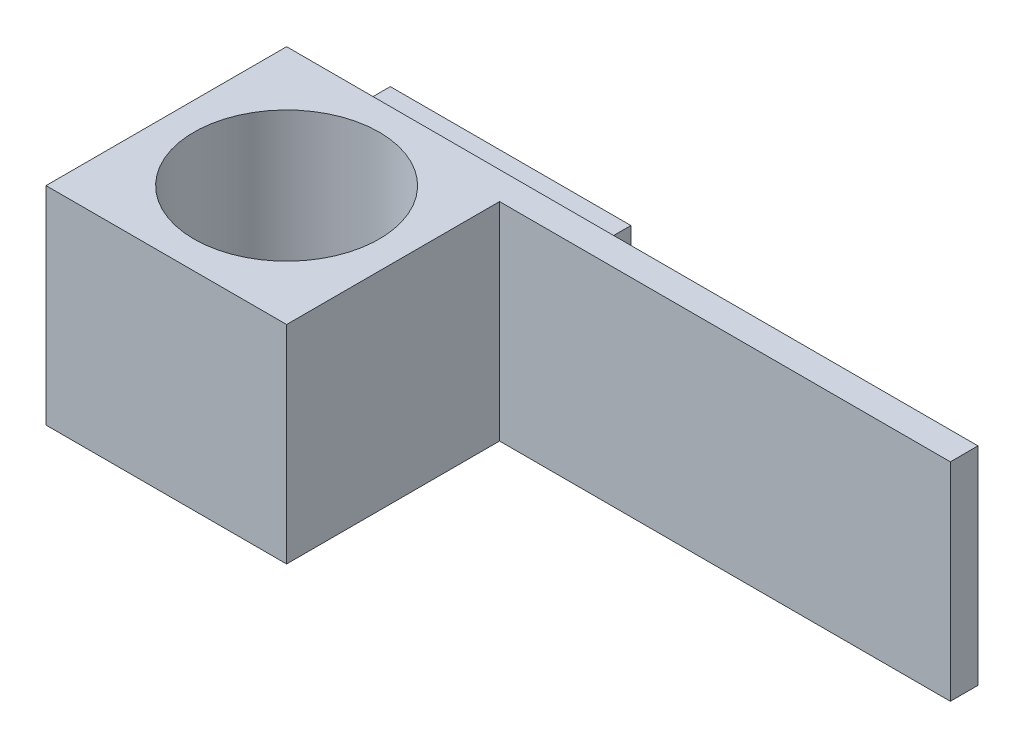
ISO-10303-21;
HEADER;
FILE_DESCRIPTION(('STEP AP214'),'2;1');
FILE_NAME('part.step','',(''),(''),'','','');
FILE_SCHEMA(('AUTOMOTIVE_DESIGN { 1 0 10303 214 1 1 1 1 }'));
ENDSEC;
DATA;
#1=APPLICATION_CONTEXT('core data for automotive mechanical design processes');
#2=APPLICATION_PROTOCOL_DEFINITION('international standard','automotive_design',2000,#1);
#3=PRODUCT_CONTEXT('',#1,'mechanical');
#4=PRODUCT('Part','Part','',(#3));
#5=PRODUCT_RELATED_PRODUCT_CATEGORY('part','',(#4));
#6=PRODUCT_DEFINITION_FORMATION('','',#4);
#7=PRODUCT_DEFINITION_CONTEXT('part definition',#1,'design');
#8=PRODUCT_DEFINITION('design','',#6,#7);
#9=PRODUCT_DEFINITION_SHAPE('','',#8);
#10=(LENGTH_UNIT() NAMED_UNIT(*) SI_UNIT(.MILLI.,.METRE.));
#11=(NAMED_UNIT(*) PLANE_ANGLE_UNIT() SI_UNIT($,.RADIAN.));
#12=(NAMED_UNIT(*) SI_UNIT($,.STERADIAN.) SOLID_ANGLE_UNIT());
#13=UNCERTAINTY_MEASURE_WITH_UNIT(LENGTH_MEASURE(1.E-05),#10,'distance_accuracy_value','');
#14=(GEOMETRIC_REPRESENTATION_CONTEXT(3) GLOBAL_UNCERTAINTY_ASSIGNED_CONTEXT((#13)) GLOBAL_UNIT_ASSIGNED_CONTEXT((#10,
#11,#12)) REPRESENTATION_CONTEXT('',''));
#15=CARTESIAN_POINT('',(0.,0.,0.));
#16=DIRECTION('',(0.,0.,1.));
#17=DIRECTION('',(1.,0.,0.));
#18=AXIS2_PLACEMENT_3D('',#15,#16,#17);
#19=CARTESIAN_POINT('',(0.,30.,-17.4));
#20=DIRECTION('',(0.,0.,-1.));
#21=DIRECTION('',(-1.,0.,0.));
#22=AXIS2_PLACEMENT_3D('',#19,#20,#21);
#23=PLANE('',#22);
#24=DIRECTION('',(-1.,0.,0.));
#25=VECTOR('',#24,1.);
#26=CARTESIAN_POINT('',(17.4,17.5,-17.4));
#27=LINE('',#26,#25);
#28=CARTESIAN_POINT('',(17.4,17.5,-17.4));
#29=VERTEX_POINT('',#28);
#30=CARTESIAN_POINT('',(-17.4,17.5,-17.4));
#31=VERTEX_POINT('',#30);
#32=EDGE_CURVE('E185',#29,#31,#27,.T.);
#33=ORIENTED_EDGE('',*,*,#32,.T.);
#34=DIRECTION('',(0.,-1.,0.));
#35=VECTOR('',#34,1.);
#36=CARTESIAN_POINT('',(-17.4,30.,-17.4));
#37=LINE('',#36,#35);
#38=CARTESIAN_POINT('',(-17.4,30.,-17.4));
#39=VERTEX_POINT('',#38);
#40=EDGE_CURVE('E43',#39,#31,#37,.T.);
#41=ORIENTED_EDGE('',*,*,#40,.F.);
#42=DIRECTION('',(1.,0.,0.));
#43=VECTOR('',#42,1.);
#44=CARTESIAN_POINT('',(0.,30.,-17.4));
#45=LINE('',#44,#43);
#46=CARTESIAN_POINT('',(82.6,30.,-17.4));
#47=VERTEX_POINT('',#46);
#48=EDGE_CURVE('E229',#39,#47,#45,.T.);
#49=ORIENTED_EDGE('',*,*,#48,.T.);
#50=DIRECTION('',(0.,-1.,0.));
#51=VECTOR('',#50,1.);
#52=CARTESIAN_POINT('',(82.6,30.,-17.4));
#53=LINE('',#52,#51);
#54=CARTESIAN_POINT('',(82.6,0.,-17.4));
#55=VERTEX_POINT('',#54);
#56=EDGE_CURVE('E11',#47,#55,#53,.T.);
#57=ORIENTED_EDGE('',*,*,#56,.T.);
#58=DIRECTION('',(1.,0.,0.));
#59=VECTOR('',#58,1.);
#60=CARTESIAN_POINT('',(0.,0.,-17.4));
#61=LINE('',#60,#59);
#62=CARTESIAN_POINT('',(17.4,0.,-17.4));
#63=VERTEX_POINT('',#62);
#64=EDGE_CURVE('E248',#63,#55,#61,.T.);
#65=ORIENTED_EDGE('',*,*,#64,.F.);
#66=DIRECTION('',(0.,1.,0.));
#67=VECTOR('',#66,1.);
#68=CARTESIAN_POINT('',(17.4,7.55713562565662,-17.4));
#69=LINE('',#68,#67);
#70=CARTESIAN_POINT('',(17.4,7.55713562565662,-17.4));
#71=VERTEX_POINT('',#70);
#72=EDGE_CURVE('E189',#63,#71,#69,.T.);
#73=ORIENTED_EDGE('',*,*,#72,.T.);
#74=DIRECTION('',(-1.,0.,0.));
#75=VECTOR('',#74,1.);
#76=CARTESIAN_POINT('',(17.4,7.55713562565662,-17.4));
#77=LINE('',#76,#75);
#78=CARTESIAN_POINT('',(-17.4,7.55713562565662,-17.4));
#79=VERTEX_POINT('',#78);
#80=EDGE_CURVE('E205',#71,#79,#77,.T.);
#81=ORIENTED_EDGE('',*,*,#80,.T.);
#82=CARTESIAN_POINT('',(-17.4,10.5571356256566,-17.4));
#83=VERTEX_POINT('',#82);
#84=EDGE_CURVE('E55',#83,#79,#37,.T.);
#85=ORIENTED_EDGE('',*,*,#84,.F.);
#86=DIRECTION('',(-1.,0.,0.));
#87=VECTOR('',#86,1.);
#88=CARTESIAN_POINT('',(17.4,10.5571356256566,-17.4));
#89=LINE('',#88,#87);
#90=CARTESIAN_POINT('',(17.4,10.5571356256566,-17.4));
#91=VERTEX_POINT('',#90);
#92=EDGE_CURVE('E150',#91,#83,#89,.T.);
#93=ORIENTED_EDGE('',*,*,#92,.F.);
#94=DIRECTION('',(0.,1.,0.));
#95=VECTOR('',#94,1.);
#96=CARTESIAN_POINT('',(17.4,17.5,-17.4));
#97=LINE('',#96,#95);
#98=EDGE_CURVE('E161',#91,#29,#97,.T.);
#99=ORIENTED_EDGE('',*,*,#98,.T.);
#100=EDGE_LOOP('',(#33,#41,#49,#57,#65,#73,#81,#85,#93,#99));
#101=FACE_BOUND('',#100,.T.);
#102=ADVANCED_FACE('F35',(#101),#23,.T.);
#103=CARTESIAN_POINT('',(82.6,30.,0.));
#104=DIRECTION('',(1.,0.,0.));
#105=DIRECTION('',(0.,0.,-1.));
#106=AXIS2_PLACEMENT_3D('',#103,#104,#105);
#107=PLANE('',#106);
#108=DIRECTION('',(0.,0.,1.));
#109=VECTOR('',#108,1.);
#110=CARTESIAN_POINT('',(82.6,0.,0.));
#111=LINE('',#110,#109);
#112=CARTESIAN_POINT('',(82.6,0.,-13.4));
#113=VERTEX_POINT('',#112);
#114=EDGE_CURVE('E245',#55,#113,#111,.T.);
#115=ORIENTED_EDGE('',*,*,#114,.F.);
#116=ORIENTED_EDGE('',*,*,#56,.F.);
#117=DIRECTION('',(0.,0.,1.));
#118=VECTOR('',#117,1.);
#119=CARTESIAN_POINT('',(82.6,30.,0.));
#120=LINE('',#119,#118);
#121=CARTESIAN_POINT('',(82.6,30.,-13.4));
#122=VERTEX_POINT('',#121);
#123=EDGE_CURVE('E225',#47,#122,#120,.T.);
#124=ORIENTED_EDGE('',*,*,#123,.T.);
#125=DIRECTION('',(0.,-1.,0.));
#126=VECTOR('',#125,1.);
#127=CARTESIAN_POINT('',(82.6,30.,-13.4));
#128=LINE('',#127,#126);
#129=EDGE_CURVE('E242',#122,#113,#128,.T.);
#130=ORIENTED_EDGE('',*,*,#129,.T.);
#131=EDGE_LOOP('',(#115,#116,#124,#130));
#132=FACE_BOUND('',#131,.T.);
#133=ADVANCED_FACE('F290',(#132),#107,.T.);
#134=CARTESIAN_POINT('',(-17.4,30.,0.));
#135=DIRECTION('',(1.,0.,0.));
#136=DIRECTION('',(0.,0.,-1.));
#137=AXIS2_PLACEMENT_3D('',#134,#135,#136);
#138=PLANE('',#137);
#139=DIRECTION('',(0.,0.,1.));
#140=VECTOR('',#139,1.);
#141=CARTESIAN_POINT('',(-17.4,0.,0.));
#142=LINE('',#141,#140);
#143=CARTESIAN_POINT('',(-17.4,0.,-32.4));
#144=VERTEX_POINT('',#143);
#145=CARTESIAN_POINT('',(-17.4,0.,17.4));
#146=VERTEX_POINT('',#145);
#147=EDGE_CURVE('E250',#144,#146,#142,.T.);
#148=ORIENTED_EDGE('',*,*,#147,.T.);
#149=DIRECTION('',(0.,-1.,0.));
#150=VECTOR('',#149,1.);
#151=CARTESIAN_POINT('',(-17.4,30.,17.4));
#152=LINE('',#151,#150);
#153=CARTESIAN_POINT('',(-17.4,30.,17.4));
#154=VERTEX_POINT('',#153);
#155=EDGE_CURVE('E266',#154,#146,#152,.T.);
#156=ORIENTED_EDGE('',*,*,#155,.F.);
#157=DIRECTION('',(0.,0.,1.));
#158=VECTOR('',#157,1.);
#159=CARTESIAN_POINT('',(-17.4,30.,0.));
#160=LINE('',#159,#158);
#161=EDGE_CURVE('E232',#39,#154,#160,.T.);
#162=ORIENTED_EDGE('',*,*,#161,.F.);
#163=ORIENTED_EDGE('',*,*,#40,.T.);
#164=DIRECTION('',(0.,0.,-1.));
#165=VECTOR('',#164,1.);
#166=CARTESIAN_POINT('',(-17.4,17.5,-32.4));
#167=LINE('',#166,#165);
#168=CARTESIAN_POINT('',(-17.4,17.5,-32.4));
#169=VERTEX_POINT('',#168);
#170=EDGE_CURVE('E168',#31,#169,#167,.T.);
#171=ORIENTED_EDGE('',*,*,#170,.T.);
#172=DIRECTION('',(0.,-1.,0.));
#173=VECTOR('',#172,1.);
#174=CARTESIAN_POINT('',(-17.4,14.5,-32.4));
#175=LINE('',#174,#173);
#176=CARTESIAN_POINT('',(-17.4,14.5,-32.4));
#177=VERTEX_POINT('',#176);
#178=EDGE_CURVE('E165',#169,#177,#175,.T.);
#179=ORIENTED_EDGE('',*,*,#178,.T.);
#180=CARTESIAN_POINT('',(-17.4,8.75,-30.6860863498997));
#181=DIRECTION('',(1.,0.,0.));
#182=DIRECTION('',(0.,0.,1.));
#183=AXIS2_PLACEMENT_3D('',#180,#181,#182);
#184=CIRCLE('',#183,6.);
#185=CARTESIAN_POINT('',(-17.4,10.5571356256566,-24.9647000816529));
#186=VERTEX_POINT('',#185);
#187=EDGE_CURVE('E176',#177,#186,#184,.T.);
#188=ORIENTED_EDGE('',*,*,#187,.T.);
#189=DIRECTION('',(0.,0.,1.));
#190=VECTOR('',#189,1.);
#191=CARTESIAN_POINT('',(-17.4,10.5571356256566,-24.9647000816529));
#192=LINE('',#191,#190);
#193=EDGE_CURVE('E50',#186,#83,#192,.T.);
#194=ORIENTED_EDGE('',*,*,#193,.T.);
#195=ORIENTED_EDGE('',*,*,#84,.T.);
#196=DIRECTION('',(0.,0.,-1.));
#197=VECTOR('',#196,1.);
#198=CARTESIAN_POINT('',(-17.4,7.55713562565662,-24.8058589236497));
#199=LINE('',#198,#197);
#200=CARTESIAN_POINT('',(-17.4,7.55713562565662,-24.8058589236497));
#201=VERTEX_POINT('',#200);
#202=EDGE_CURVE('E182',#79,#201,#199,.T.);
#203=ORIENTED_EDGE('',*,*,#202,.T.);
#204=CARTESIAN_POINT('',(-17.4,8.75,-30.6860863498997));
#205=DIRECTION('',(1.,0.,0.));
#206=DIRECTION('',(0.,0.,1.));
#207=AXIS2_PLACEMENT_3D('',#204,#205,#206);
#208=CIRCLE('',#207,6.);
#209=CARTESIAN_POINT('',(-17.4,3.,-32.4));
#210=VERTEX_POINT('',#209);
#211=EDGE_CURVE('E207',#201,#210,#208,.T.);
#212=ORIENTED_EDGE('',*,*,#211,.T.);
#213=DIRECTION('',(0.,-1.,0.));
#214=VECTOR('',#213,1.);
#215=CARTESIAN_POINT('',(-17.4,0.,-32.4));
#216=LINE('',#215,#214);
#217=EDGE_CURVE('E193',#210,#144,#216,.T.);
#218=ORIENTED_EDGE('',*,*,#217,.T.);
#219=EDGE_LOOP('',(#148,#156,#162,#163,#171,#179,#188,#194,#195,#203,#212,#218));
#220=FACE_BOUND('',#219,.T.);
#221=ADVANCED_FACE('F270',(#220),#138,.F.);
#222=CARTESIAN_POINT('',(0.,30.,17.4));
#223=DIRECTION('',(0.,0.,-1.));
#224=DIRECTION('',(-1.,0.,0.));
#225=AXIS2_PLACEMENT_3D('',#222,#223,#224);
#226=PLANE('',#225);
#227=DIRECTION('',(1.,0.,0.));
#228=VECTOR('',#227,1.);
#229=CARTESIAN_POINT('',(0.,0.,17.4));
#230=LINE('',#229,#228);
#231=CARTESIAN_POINT('',(17.4,0.,17.4));
#232=VERTEX_POINT('',#231);
#233=EDGE_CURVE('E253',#146,#232,#230,.T.);
#234=ORIENTED_EDGE('',*,*,#233,.T.);
#235=DIRECTION('',(0.,-1.,0.));
#236=VECTOR('',#235,1.);
#237=CARTESIAN_POINT('',(17.4,30.,17.4));
#238=LINE('',#237,#236);
#239=CARTESIAN_POINT('',(17.4,30.,17.4));
#240=VERTEX_POINT('',#239);
#241=EDGE_CURVE('E264',#240,#232,#238,.T.);
#242=ORIENTED_EDGE('',*,*,#241,.F.);
#243=DIRECTION('',(1.,0.,0.));
#244=VECTOR('',#243,1.);
#245=CARTESIAN_POINT('',(0.,30.,17.4));
#246=LINE('',#245,#244);
#247=EDGE_CURVE('E235',#154,#240,#246,.T.);
#248=ORIENTED_EDGE('',*,*,#247,.F.);
#249=ORIENTED_EDGE('',*,*,#155,.T.);
#250=EDGE_LOOP('',(#234,#242,#248,#249));
#251=FACE_BOUND('',#250,.T.);
#252=ADVANCED_FACE('F299',(#251),#226,.F.);
#253=CARTESIAN_POINT('',(17.4,30.,0.));
#254=DIRECTION('',(1.,0.,0.));
#255=DIRECTION('',(0.,0.,-1.));
#256=AXIS2_PLACEMENT_3D('',#253,#254,#255);
#257=PLANE('',#256);
#258=DIRECTION('',(0.,0.,1.));
#259=VECTOR('',#258,1.);
#260=CARTESIAN_POINT('',(17.4,0.,0.));
#261=LINE('',#260,#259);
#262=CARTESIAN_POINT('',(17.4,0.,-13.4));
#263=VERTEX_POINT('',#262);
#264=EDGE_CURVE('E256',#263,#232,#261,.T.);
#265=ORIENTED_EDGE('',*,*,#264,.F.);
#266=DIRECTION('',(0.,-1.,0.));
#267=VECTOR('',#266,1.);
#268=CARTESIAN_POINT('',(17.4,30.,-13.4));
#269=LINE('',#268,#267);
#270=CARTESIAN_POINT('',(17.4,30.,-13.4));
#271=VERTEX_POINT('',#270);
#272=EDGE_CURVE('E262',#271,#263,#269,.T.);
#273=ORIENTED_EDGE('',*,*,#272,.F.);
#274=DIRECTION('',(0.,0.,1.));
#275=VECTOR('',#274,1.);
#276=CARTESIAN_POINT('',(17.4,30.,0.));
#277=LINE('',#276,#275);
#278=EDGE_CURVE('E237',#271,#240,#277,.T.);
#279=ORIENTED_EDGE('',*,*,#278,.T.);
#280=ORIENTED_EDGE('',*,*,#241,.T.);
#281=EDGE_LOOP('',(#265,#273,#279,#280));
#282=FACE_BOUND('',#281,.T.);
#283=ADVANCED_FACE('F302',(#282),#257,.T.);
#284=CARTESIAN_POINT('',(0.,30.,0.));
#285=DIRECTION('',(0.,-1.,0.));
#286=DIRECTION('',(0.,0.,-1.));
#287=AXIS2_PLACEMENT_3D('',#284,#285,#286);
#288=CYLINDRICAL_SURFACE('',#287,13.4);
#289=CARTESIAN_POINT('',(0.,30.,0.));
#290=DIRECTION('',(0.,1.,0.));
#291=DIRECTION('',(0.,0.,1.));
#292=AXIS2_PLACEMENT_3D('',#289,#290,#291);
#293=CIRCLE('',#292,13.4);
#294=CARTESIAN_POINT('',(0.,30.,13.4));
#295=VERTEX_POINT('',#294);
#296=EDGE_CURVE('E222',#295,#295,#293,.T.);
#297=ORIENTED_EDGE('',*,*,#296,.T.);
#298=EDGE_LOOP('',(#297));
#299=FACE_BOUND('',#298,.T.);
#300=CARTESIAN_POINT('',(0.,0.,0.));
#301=DIRECTION('',(0.,1.,0.));
#302=DIRECTION('',(0.,0.,1.));
#303=AXIS2_PLACEMENT_3D('',#300,#301,#302);
#304=CIRCLE('',#303,13.4);
#305=CARTESIAN_POINT('',(0.,0.,13.4));
#306=VERTEX_POINT('',#305);
#307=EDGE_CURVE('E215',#306,#306,#304,.T.);
#308=ORIENTED_EDGE('',*,*,#307,.F.);
#309=EDGE_LOOP('',(#308));
#310=FACE_BOUND('',#309,.T.);
#311=ADVANCED_FACE('F37',(#299,#310),#288,.F.);
#312=CARTESIAN_POINT('',(0.,30.,-13.4));
#313=DIRECTION('',(0.,0.,-1.));
#314=DIRECTION('',(-1.,0.,0.));
#315=AXIS2_PLACEMENT_3D('',#312,#313,#314);
#316=PLANE('',#315);
#317=DIRECTION('',(1.,0.,0.));
#318=VECTOR('',#317,1.);
#319=CARTESIAN_POINT('',(0.,0.,-13.4));
#320=LINE('',#319,#318);
#321=EDGE_CURVE('E226',#263,#113,#320,.T.);
#322=ORIENTED_EDGE('',*,*,#321,.T.);
#323=ORIENTED_EDGE('',*,*,#129,.F.);
#324=DIRECTION('',(1.,0.,0.));
#325=VECTOR('',#324,1.);
#326=CARTESIAN_POINT('',(0.,30.,-13.4));
#327=LINE('',#326,#325);
#328=EDGE_CURVE('E240',#271,#122,#327,.T.);
#329=ORIENTED_EDGE('',*,*,#328,.F.);
#330=ORIENTED_EDGE('',*,*,#272,.T.);
#331=EDGE_LOOP('',(#322,#323,#329,#330));
#332=FACE_BOUND('',#331,.T.);
#333=ADVANCED_FACE('F307',(#332),#316,.F.);
#334=CARTESIAN_POINT('',(0.,30.,0.));
#335=DIRECTION('',(0.,1.,0.));
#336=DIRECTION('',(0.,0.,1.));
#337=AXIS2_PLACEMENT_3D('',#334,#335,#336);
#338=PLANE('',#337);
#339=ORIENTED_EDGE('',*,*,#296,.F.);
#340=EDGE_LOOP('',(#339));
#341=FACE_BOUND('',#340,.T.);
#342=ORIENTED_EDGE('',*,*,#123,.F.);
#343=ORIENTED_EDGE('',*,*,#48,.F.);
#344=ORIENTED_EDGE('',*,*,#161,.T.);
#345=ORIENTED_EDGE('',*,*,#247,.T.);
#346=ORIENTED_EDGE('',*,*,#278,.F.);
#347=ORIENTED_EDGE('',*,*,#328,.T.);
#348=EDGE_LOOP('',(#342,#343,#344,#345,#346,#347));
#349=FACE_BOUND('',#348,.T.);
#350=ADVANCED_FACE('F310',(#341,#349),#338,.T.);
#351=CARTESIAN_POINT('',(0.,0.,0.));
#352=DIRECTION('',(0.,1.,0.));
#353=DIRECTION('',(0.,0.,1.));
#354=AXIS2_PLACEMENT_3D('',#351,#352,#353);
#355=PLANE('',#354);
#356=ORIENTED_EDGE('',*,*,#307,.T.);
#357=EDGE_LOOP('',(#356));
#358=FACE_BOUND('',#357,.T.);
#359=ORIENTED_EDGE('',*,*,#114,.T.);
#360=ORIENTED_EDGE('',*,*,#321,.F.);
#361=ORIENTED_EDGE('',*,*,#264,.T.);
#362=ORIENTED_EDGE('',*,*,#233,.F.);
#363=ORIENTED_EDGE('',*,*,#147,.F.);
#364=DIRECTION('',(-1.,0.,0.));
#365=VECTOR('',#364,1.);
#366=CARTESIAN_POINT('',(17.4,0.,-32.4));
#367=LINE('',#366,#365);
#368=CARTESIAN_POINT('',(17.4,0.,-32.4));
#369=VERTEX_POINT('',#368);
#370=EDGE_CURVE('E212',#369,#144,#367,.T.);
#371=ORIENTED_EDGE('',*,*,#370,.F.);
#372=DIRECTION('',(0.,0.,1.));
#373=VECTOR('',#372,1.);
#374=CARTESIAN_POINT('',(17.4,0.,-17.4));
#375=LINE('',#374,#373);
#376=EDGE_CURVE('E202',#369,#63,#375,.T.);
#377=ORIENTED_EDGE('',*,*,#376,.T.);
#378=ORIENTED_EDGE('',*,*,#64,.T.);
#379=EDGE_LOOP('',(#359,#360,#361,#362,#363,#371,#377,#378));
#380=FACE_BOUND('',#379,.T.);
#381=ADVANCED_FACE('F312',(#358,#380),#355,.F.);
#382=CARTESIAN_POINT('',(17.4,0.,-32.4));
#383=DIRECTION('',(0.,0.,-1.));
#384=DIRECTION('',(-1.,0.,0.));
#385=AXIS2_PLACEMENT_3D('',#382,#383,#384);
#386=PLANE('',#385);
#387=ORIENTED_EDGE('',*,*,#217,.F.);
#388=DIRECTION('',(-1.,0.,0.));
#389=VECTOR('',#388,1.);
#390=CARTESIAN_POINT('',(17.4,3.,-32.4));
#391=LINE('',#390,#389);
#392=CARTESIAN_POINT('',(17.4,3.,-32.4));
#393=VERTEX_POINT('',#392);
#394=EDGE_CURVE('E216',#393,#210,#391,.T.);
#395=ORIENTED_EDGE('',*,*,#394,.F.);
#396=DIRECTION('',(0.,-1.,0.));
#397=VECTOR('',#396,1.);
#398=CARTESIAN_POINT('',(17.4,0.,-32.4));
#399=LINE('',#398,#397);
#400=EDGE_CURVE('E199',#393,#369,#399,.T.);
#401=ORIENTED_EDGE('',*,*,#400,.T.);
#402=ORIENTED_EDGE('',*,*,#370,.T.);
#403=EDGE_LOOP('',(#387,#395,#401,#402));
#404=FACE_BOUND('',#403,.T.);
#405=ADVANCED_FACE('F315',(#404),#386,.T.);
#406=CARTESIAN_POINT('',(17.4,8.75,-30.6860863498997));
#407=DIRECTION('',(-1.,0.,0.));
#408=DIRECTION('',(0.,0.,1.));
#409=AXIS2_PLACEMENT_3D('',#406,#407,#408);
#410=CYLINDRICAL_SURFACE('',#409,6.);
#411=ORIENTED_EDGE('',*,*,#211,.F.);
#412=DIRECTION('',(-1.,0.,0.));
#413=VECTOR('',#412,1.);
#414=CARTESIAN_POINT('',(17.4,7.55713562565662,-24.8058589236498));
#415=LINE('',#414,#413);
#416=CARTESIAN_POINT('',(17.4,7.55713562565662,-24.8058589236498));
#417=VERTEX_POINT('',#416);
#418=EDGE_CURVE('E218',#417,#201,#415,.T.);
#419=ORIENTED_EDGE('',*,*,#418,.F.);
#420=CARTESIAN_POINT('',(17.4,8.75,-30.6860863498997));
#421=DIRECTION('',(1.,0.,0.));
#422=DIRECTION('',(0.,0.,1.));
#423=AXIS2_PLACEMENT_3D('',#420,#421,#422);
#424=CIRCLE('',#423,6.);
#425=EDGE_CURVE('E196',#417,#393,#424,.T.);
#426=ORIENTED_EDGE('',*,*,#425,.T.);
#427=ORIENTED_EDGE('',*,*,#394,.T.);
#428=EDGE_LOOP('',(#411,#419,#426,#427));
#429=FACE_BOUND('',#428,.T.);
#430=ADVANCED_FACE('F323',(#429),#410,.F.);
#431=CARTESIAN_POINT('',(17.4,7.55713562565662,-24.8058589236498));
#432=DIRECTION('',(0.,1.,0.));
#433=DIRECTION('',(0.,0.,1.));
#434=AXIS2_PLACEMENT_3D('',#431,#432,#433);
#435=PLANE('',#434);
#436=ORIENTED_EDGE('',*,*,#202,.F.);
#437=ORIENTED_EDGE('',*,*,#80,.F.);
#438=DIRECTION('',(0.,0.,-1.));
#439=VECTOR('',#438,1.);
#440=CARTESIAN_POINT('',(17.4,7.55713562565662,-24.8058589236498));
#441=LINE('',#440,#439);
#442=EDGE_CURVE('E192',#71,#417,#441,.T.);
#443=ORIENTED_EDGE('',*,*,#442,.T.);
#444=ORIENTED_EDGE('',*,*,#418,.T.);
#445=EDGE_LOOP('',(#436,#437,#443,#444));
#446=FACE_BOUND('',#445,.T.);
#447=ADVANCED_FACE('F320',(#446),#435,.T.);
#448=CARTESIAN_POINT('',(17.4,8.75,-30.6860863498997));
#449=DIRECTION('',(-1.,0.,0.));
#450=DIRECTION('',(0.,0.,1.));
#451=AXIS2_PLACEMENT_3D('',#448,#449,#450);
#452=PLANE('',#451);
#453=ORIENTED_EDGE('',*,*,#72,.F.);
#454=ORIENTED_EDGE('',*,*,#376,.F.);
#455=ORIENTED_EDGE('',*,*,#400,.F.);
#456=ORIENTED_EDGE('',*,*,#425,.F.);
#457=ORIENTED_EDGE('',*,*,#442,.F.);
#458=EDGE_LOOP('',(#453,#454,#455,#456,#457));
#459=FACE_BOUND('',#458,.T.);
#460=ADVANCED_FACE('F286',(#459),#452,.F.);
#461=CARTESIAN_POINT('',(17.4,8.75,-30.6860863498997));
#462=DIRECTION('',(-1.,0.,0.));
#463=DIRECTION('',(0.,0.,1.));
#464=AXIS2_PLACEMENT_3D('',#461,#462,#463);
#465=CYLINDRICAL_SURFACE('',#464,6.);
#466=ORIENTED_EDGE('',*,*,#187,.F.);
#467=DIRECTION('',(-1.,0.,0.));
#468=VECTOR('',#467,1.);
#469=CARTESIAN_POINT('',(17.4,14.5,-32.4));
#470=LINE('',#469,#468);
#471=CARTESIAN_POINT('',(17.4,14.5,-32.4));
#472=VERTEX_POINT('',#471);
#473=EDGE_CURVE('E164',#472,#177,#470,.T.);
#474=ORIENTED_EDGE('',*,*,#473,.F.);
#475=CARTESIAN_POINT('',(17.4,8.75,-30.6860863498997));
#476=DIRECTION('',(1.,0.,0.));
#477=DIRECTION('',(0.,0.,1.));
#478=AXIS2_PLACEMENT_3D('',#475,#476,#477);
#479=CIRCLE('',#478,6.);
#480=CARTESIAN_POINT('',(17.4,10.5571356256566,-24.964700081653));
#481=VERTEX_POINT('',#480);
#482=EDGE_CURVE('E157',#472,#481,#479,.T.);
#483=ORIENTED_EDGE('',*,*,#482,.T.);
#484=DIRECTION('',(-1.,0.,0.));
#485=VECTOR('',#484,1.);
#486=CARTESIAN_POINT('',(17.4,10.5571356256566,-24.964700081653));
#487=LINE('',#486,#485);
#488=EDGE_CURVE('E142',#481,#186,#487,.T.);
#489=ORIENTED_EDGE('',*,*,#488,.T.);
#490=EDGE_LOOP('',(#466,#474,#483,#489));
#491=FACE_BOUND('',#490,.T.);
#492=ADVANCED_FACE('F163',(#491),#465,.F.);
#493=CARTESIAN_POINT('',(17.4,14.5,-32.4));
#494=DIRECTION('',(0.,0.,-1.));
#495=DIRECTION('',(0.,1.,0.));
#496=AXIS2_PLACEMENT_3D('',#493,#494,#495);
#497=PLANE('',#496);
#498=ORIENTED_EDGE('',*,*,#178,.F.);
#499=DIRECTION('',(-1.,0.,0.));
#500=VECTOR('',#499,1.);
#501=CARTESIAN_POINT('',(17.4,17.5,-32.4));
#502=LINE('',#501,#500);
#503=CARTESIAN_POINT('',(17.4,17.5,-32.4));
#504=VERTEX_POINT('',#503);
#505=EDGE_CURVE('E183',#504,#169,#502,.T.);
#506=ORIENTED_EDGE('',*,*,#505,.F.);
#507=DIRECTION('',(0.,-1.,0.));
#508=VECTOR('',#507,1.);
#509=CARTESIAN_POINT('',(17.4,14.5,-32.4));
#510=LINE('',#509,#508);
#511=EDGE_CURVE('E151',#504,#472,#510,.T.);
#512=ORIENTED_EDGE('',*,*,#511,.T.);
#513=ORIENTED_EDGE('',*,*,#473,.T.);
#514=EDGE_LOOP('',(#498,#506,#512,#513));
#515=FACE_BOUND('',#514,.T.);
#516=ADVANCED_FACE('F278',(#515),#497,.T.);
#517=CARTESIAN_POINT('',(17.4,17.5,-32.4));
#518=DIRECTION('',(0.,1.,0.));
#519=DIRECTION('',(0.,0.,1.));
#520=AXIS2_PLACEMENT_3D('',#517,#518,#519);
#521=PLANE('',#520);
#522=ORIENTED_EDGE('',*,*,#170,.F.);
#523=ORIENTED_EDGE('',*,*,#32,.F.);
#524=DIRECTION('',(0.,0.,-1.));
#525=VECTOR('',#524,1.);
#526=CARTESIAN_POINT('',(17.4,17.5,-32.4));
#527=LINE('',#526,#525);
#528=EDGE_CURVE('E172',#29,#504,#527,.T.);
#529=ORIENTED_EDGE('',*,*,#528,.T.);
#530=ORIENTED_EDGE('',*,*,#505,.T.);
#531=EDGE_LOOP('',(#522,#523,#529,#530));
#532=FACE_BOUND('',#531,.T.);
#533=ADVANCED_FACE('F276',(#532),#521,.T.);
#534=CARTESIAN_POINT('',(17.4,10.5571356256566,-24.964700081653));
#535=DIRECTION('',(0.,-1.,0.));
#536=DIRECTION('',(0.,0.,-1.));
#537=AXIS2_PLACEMENT_3D('',#534,#535,#536);
#538=PLANE('',#537);
#539=ORIENTED_EDGE('',*,*,#193,.F.);
#540=ORIENTED_EDGE('',*,*,#488,.F.);
#541=DIRECTION('',(0.,0.,1.));
#542=VECTOR('',#541,1.);
#543=CARTESIAN_POINT('',(17.4,10.5571356256566,-24.964700081653));
#544=LINE('',#543,#542);
#545=EDGE_CURVE('E145',#481,#91,#544,.T.);
#546=ORIENTED_EDGE('',*,*,#545,.T.);
#547=ORIENTED_EDGE('',*,*,#92,.T.);
#548=EDGE_LOOP('',(#539,#540,#546,#547));
#549=FACE_BOUND('',#548,.T.);
#550=ADVANCED_FACE('F144',(#549),#538,.T.);
#551=CARTESIAN_POINT('',(17.4,8.75,-30.6860863498997));
#552=DIRECTION('',(-1.,0.,0.));
#553=DIRECTION('',(0.,0.,1.));
#554=AXIS2_PLACEMENT_3D('',#551,#552,#553);
#555=PLANE('',#554);
#556=ORIENTED_EDGE('',*,*,#482,.F.);
#557=ORIENTED_EDGE('',*,*,#511,.F.);
#558=ORIENTED_EDGE('',*,*,#528,.F.);
#559=ORIENTED_EDGE('',*,*,#98,.F.);
#560=ORIENTED_EDGE('',*,*,#545,.F.);
#561=EDGE_LOOP('',(#556,#557,#558,#559,#560));
#562=FACE_BOUND('',#561,.T.);
#563=ADVANCED_FACE('F155',(#562),#555,.F.);
#564=CLOSED_SHELL('',(#102,#133,#221,#252,#283,#311,#333,#350,#381,#405,#430,#447,#460,#492,
#516,#533,#550,#563));
#565=MANIFOLD_SOLID_BREP('B2',#564);
#566=ADVANCED_BREP_SHAPE_REPRESENTATION('',(#18,#565),#14);
#567=SHAPE_DEFINITION_REPRESENTATION(#9,#566);
ENDSEC;
END-ISO-10303-21;
